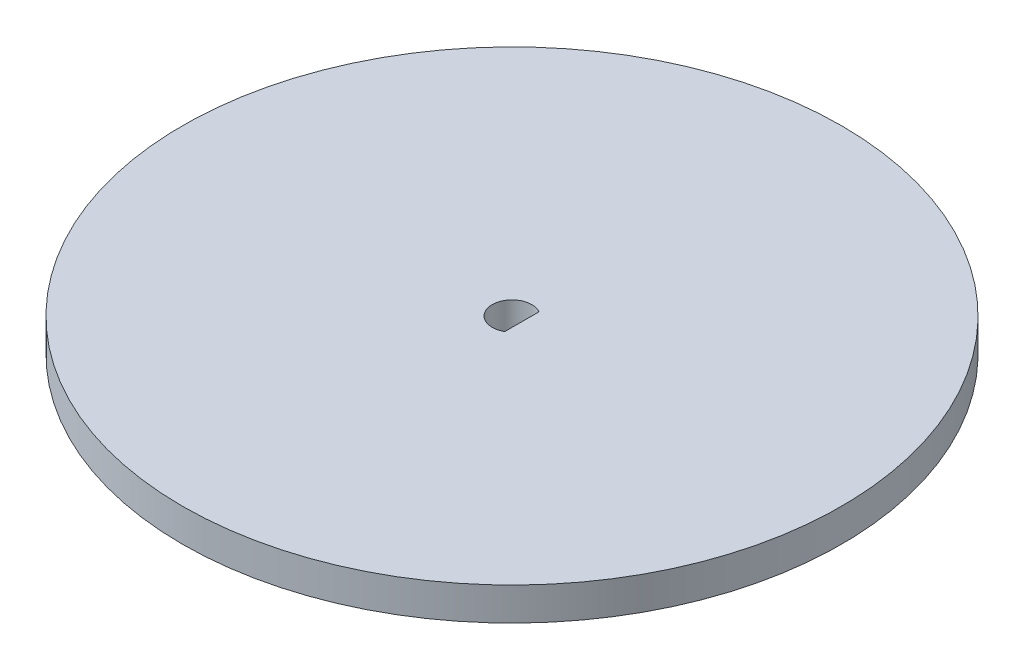
ISO-10303-21;
HEADER;
FILE_DESCRIPTION(('STEP AP214'),'2;1');
FILE_NAME('part.step','',(''),(''),'','','');
FILE_SCHEMA(('AUTOMOTIVE_DESIGN { 1 0 10303 214 1 1 1 1 }'));
ENDSEC;
DATA;
#1=APPLICATION_CONTEXT('core data for automotive mechanical design processes');
#2=APPLICATION_PROTOCOL_DEFINITION('international standard','automotive_design',2000,#1);
#3=PRODUCT_CONTEXT('',#1,'mechanical');
#4=PRODUCT('Part','Part','',(#3));
#5=PRODUCT_RELATED_PRODUCT_CATEGORY('part','',(#4));
#6=PRODUCT_DEFINITION_FORMATION('','',#4);
#7=PRODUCT_DEFINITION_CONTEXT('part definition',#1,'design');
#8=PRODUCT_DEFINITION('design','',#6,#7);
#9=PRODUCT_DEFINITION_SHAPE('','',#8);
#10=(LENGTH_UNIT() NAMED_UNIT(*) SI_UNIT(.MILLI.,.METRE.));
#11=(NAMED_UNIT(*) PLANE_ANGLE_UNIT() SI_UNIT($,.RADIAN.));
#12=(NAMED_UNIT(*) SI_UNIT($,.STERADIAN.) SOLID_ANGLE_UNIT());
#13=UNCERTAINTY_MEASURE_WITH_UNIT(LENGTH_MEASURE(1.E-05),#10,'distance_accuracy_value','');
#14=(GEOMETRIC_REPRESENTATION_CONTEXT(3) GLOBAL_UNCERTAINTY_ASSIGNED_CONTEXT((#13)) GLOBAL_UNIT_ASSIGNED_CONTEXT((#10,
#11,#12)) REPRESENTATION_CONTEXT('',''));
#15=CARTESIAN_POINT('',(0.,0.,0.));
#16=DIRECTION('',(0.,0.,1.));
#17=DIRECTION('',(1.,0.,0.));
#18=AXIS2_PLACEMENT_3D('',#15,#16,#17);
#19=CARTESIAN_POINT('',(0.,5.,0.));
#20=DIRECTION('',(0.,1.,0.));
#21=DIRECTION('',(0.,0.,1.));
#22=AXIS2_PLACEMENT_3D('',#19,#20,#21);
#23=PLANE('',#22);
#24=CARTESIAN_POINT('',(0.,5.,0.));
#25=DIRECTION('',(0.,1.,0.));
#26=DIRECTION('',(0.,0.,1.));
#27=AXIS2_PLACEMENT_3D('',#24,#25,#26);
#28=CIRCLE('',#27,50.);
#29=CARTESIAN_POINT('',(0.,5.,50.));
#30=VERTEX_POINT('',#29);
#31=EDGE_CURVE('E11',#30,#30,#28,.T.);
#32=ORIENTED_EDGE('',*,*,#31,.T.);
#33=EDGE_LOOP('',(#32));
#34=FACE_BOUND('',#33,.T.);
#35=DIRECTION('',(0.,0.,-1.));
#36=VECTOR('',#35,1.);
#37=CARTESIAN_POINT('',(1.5,5.,-2.59807621135332));
#38=LINE('',#37,#36);
#39=CARTESIAN_POINT('',(1.5,5.,2.59807621135332));
#40=VERTEX_POINT('',#39);
#41=CARTESIAN_POINT('',(1.5,5.,-2.59807621135332));
#42=VERTEX_POINT('',#41);
#43=EDGE_CURVE('E76',#40,#42,#38,.T.);
#44=ORIENTED_EDGE('',*,*,#43,.F.);
#45=CARTESIAN_POINT('',(0.,5.,0.));
#46=DIRECTION('',(0.,1.,0.));
#47=DIRECTION('',(0.,0.,1.));
#48=AXIS2_PLACEMENT_3D('',#45,#46,#47);
#49=CIRCLE('',#48,3.);
#50=EDGE_CURVE('E67',#42,#40,#49,.T.);
#51=ORIENTED_EDGE('',*,*,#50,.F.);
#52=EDGE_LOOP('',(#44,#51));
#53=FACE_BOUND('',#52,.T.);
#54=ADVANCED_FACE('F35',(#34,#53),#23,.T.);
#55=CARTESIAN_POINT('',(0.,0.,0.));
#56=DIRECTION('',(0.,1.,0.));
#57=DIRECTION('',(0.,0.,1.));
#58=AXIS2_PLACEMENT_3D('',#55,#56,#57);
#59=PLANE('',#58);
#60=CARTESIAN_POINT('',(0.,0.,0.));
#61=DIRECTION('',(0.,1.,0.));
#62=DIRECTION('',(0.,0.,1.));
#63=AXIS2_PLACEMENT_3D('',#60,#61,#62);
#64=CIRCLE('',#63,50.);
#65=CARTESIAN_POINT('',(0.,0.,50.));
#66=VERTEX_POINT('',#65);
#67=EDGE_CURVE('E39',#66,#66,#64,.T.);
#68=ORIENTED_EDGE('',*,*,#67,.F.);
#69=EDGE_LOOP('',(#68));
#70=FACE_BOUND('',#69,.T.);
#71=CARTESIAN_POINT('',(0.,0.,0.));
#72=DIRECTION('',(0.,1.,0.));
#73=DIRECTION('',(0.,0.,1.));
#74=AXIS2_PLACEMENT_3D('',#71,#72,#73);
#75=CIRCLE('',#74,3.);
#76=CARTESIAN_POINT('',(1.5,0.,-2.59807621135332));
#77=VERTEX_POINT('',#76);
#78=CARTESIAN_POINT('',(1.5,0.,2.59807621135332));
#79=VERTEX_POINT('',#78);
#80=EDGE_CURVE('E57',#77,#79,#75,.T.);
#81=ORIENTED_EDGE('',*,*,#80,.T.);
#82=DIRECTION('',(0.,0.,-1.));
#83=VECTOR('',#82,1.);
#84=CARTESIAN_POINT('',(1.5,0.,-2.59807621135332));
#85=LINE('',#84,#83);
#86=EDGE_CURVE('E63',#79,#77,#85,.T.);
#87=ORIENTED_EDGE('',*,*,#86,.T.);
#88=EDGE_LOOP('',(#81,#87));
#89=FACE_BOUND('',#88,.T.);
#90=ADVANCED_FACE('F73',(#70,#89),#59,.F.);
#91=CARTESIAN_POINT('',(0.,5.,0.));
#92=DIRECTION('',(0.,-1.,0.));
#93=DIRECTION('',(0.,0.,-1.));
#94=AXIS2_PLACEMENT_3D('',#91,#92,#93);
#95=CYLINDRICAL_SURFACE('',#94,50.);
#96=ORIENTED_EDGE('',*,*,#31,.F.);
#97=EDGE_LOOP('',(#96));
#98=FACE_BOUND('',#97,.T.);
#99=ORIENTED_EDGE('',*,*,#67,.T.);
#100=EDGE_LOOP('',(#99));
#101=FACE_BOUND('',#100,.T.);
#102=ADVANCED_FACE('F37',(#98,#101),#95,.T.);
#103=CARTESIAN_POINT('',(0.,5.,0.));
#104=DIRECTION('',(0.,-1.,0.));
#105=DIRECTION('',(0.,0.,-1.));
#106=AXIS2_PLACEMENT_3D('',#103,#104,#105);
#107=CYLINDRICAL_SURFACE('',#106,3.);
#108=ORIENTED_EDGE('',*,*,#80,.F.);
#109=DIRECTION('',(0.,-1.,0.));
#110=VECTOR('',#109,1.);
#111=CARTESIAN_POINT('',(1.5,5.,-2.59807621135332));
#112=LINE('',#111,#110);
#113=EDGE_CURVE('E65',#42,#77,#112,.T.);
#114=ORIENTED_EDGE('',*,*,#113,.F.);
#115=ORIENTED_EDGE('',*,*,#50,.T.);
#116=DIRECTION('',(0.,-1.,0.));
#117=VECTOR('',#116,1.);
#118=CARTESIAN_POINT('',(1.5,5.,2.59807621135332));
#119=LINE('',#118,#117);
#120=EDGE_CURVE('E50',#40,#79,#119,.T.);
#121=ORIENTED_EDGE('',*,*,#120,.T.);
#122=EDGE_LOOP('',(#108,#114,#115,#121));
#123=FACE_BOUND('',#122,.T.);
#124=ADVANCED_FACE('F69',(#123),#107,.F.);
#125=CARTESIAN_POINT('',(1.5,5.,-2.59807621135332));
#126=DIRECTION('',(-1.,0.,0.));
#127=DIRECTION('',(0.,0.,1.));
#128=AXIS2_PLACEMENT_3D('',#125,#126,#127);
#129=PLANE('',#128);
#130=ORIENTED_EDGE('',*,*,#86,.F.);
#131=ORIENTED_EDGE('',*,*,#120,.F.);
#132=ORIENTED_EDGE('',*,*,#43,.T.);
#133=ORIENTED_EDGE('',*,*,#113,.T.);
#134=EDGE_LOOP('',(#130,#131,#132,#133));
#135=FACE_BOUND('',#134,.T.);
#136=ADVANCED_FACE('F64',(#135),#129,.T.);
#137=CLOSED_SHELL('',(#54,#90,#102,#124,#136));
#138=MANIFOLD_SOLID_BREP('B2',#137);
#139=ADVANCED_BREP_SHAPE_REPRESENTATION('',(#18,#138),#14);
#140=SHAPE_DEFINITION_REPRESENTATION(#9,#139);
ENDSEC;
END-ISO-10303-21;
